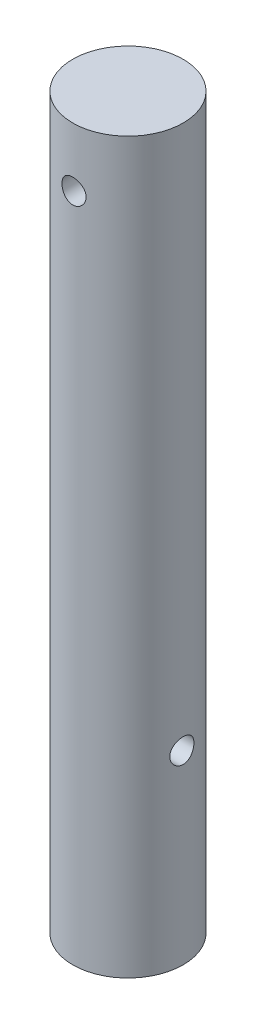
ISO-10303-21;
HEADER;
FILE_DESCRIPTION(('STEP AP214'),'2;1');
FILE_NAME('part.step','',(''),(''),'','','');
FILE_SCHEMA(('AUTOMOTIVE_DESIGN { 1 0 10303 214 1 1 1 1 }'));
ENDSEC;
DATA;
#1=APPLICATION_CONTEXT('core data for automotive mechanical design processes');
#2=APPLICATION_PROTOCOL_DEFINITION('international standard','automotive_design',2000,#1);
#3=PRODUCT_CONTEXT('',#1,'mechanical');
#4=PRODUCT('Part','Part','',(#3));
#5=PRODUCT_RELATED_PRODUCT_CATEGORY('part','',(#4));
#6=PRODUCT_DEFINITION_FORMATION('','',#4);
#7=PRODUCT_DEFINITION_CONTEXT('part definition',#1,'design');
#8=PRODUCT_DEFINITION('design','',#6,#7);
#9=PRODUCT_DEFINITION_SHAPE('','',#8);
#10=(LENGTH_UNIT() NAMED_UNIT(*) SI_UNIT(.MILLI.,.METRE.));
#11=(NAMED_UNIT(*) PLANE_ANGLE_UNIT() SI_UNIT($,.RADIAN.));
#12=(NAMED_UNIT(*) SI_UNIT($,.STERADIAN.) SOLID_ANGLE_UNIT());
#13=UNCERTAINTY_MEASURE_WITH_UNIT(LENGTH_MEASURE(1.E-05),#10,'distance_accuracy_value','');
#14=(GEOMETRIC_REPRESENTATION_CONTEXT(3) GLOBAL_UNCERTAINTY_ASSIGNED_CONTEXT((#13)) GLOBAL_UNIT_ASSIGNED_CONTEXT((#10,
#11,#12)) REPRESENTATION_CONTEXT('',''));
#15=CARTESIAN_POINT('',(0.,0.,0.));
#16=DIRECTION('',(0.,0.,1.));
#17=DIRECTION('',(1.,0.,0.));
#18=AXIS2_PLACEMENT_3D('',#15,#16,#17);
#19=CARTESIAN_POINT('',(0.,-9.525,0.));
#20=DIRECTION('',(0.,1.,0.));
#21=DIRECTION('',(0.,0.,1.));
#22=AXIS2_PLACEMENT_3D('',#19,#20,#21);
#23=CYLINDRICAL_SURFACE('',#22,4.7625);
#24=CARTESIAN_POINT('',(-4.64724566705915,-46.863,-1.0414));
#25=CARTESIAN_POINT('',(-4.64724683426293,-46.8052594354549,-1.04139801362496));
#26=CARTESIAN_POINT('',(-4.64833350092517,-46.7474949910105,-1.03658151779939));
#27=CARTESIAN_POINT('',(-4.65255476760777,-46.6336087908007,-1.01746386740255));
#28=CARTESIAN_POINT('',(-4.6556908487515,-46.5774882537678,-1.00315585314442));
#29=CARTESIAN_POINT('',(-4.66363917155119,-46.4685537577196,-0.965527203784959));
#30=CARTESIAN_POINT('',(-4.66844957404701,-46.4157362452833,-0.942216454681358));
#31=CARTESIAN_POINT('',(-4.679202313415,-46.3147605410028,-0.887272324034088));
#32=CARTESIAN_POINT('',(-4.68514462682847,-46.2666022526281,-0.855639114967133));
#33=CARTESIAN_POINT('',(-4.69760372982455,-46.1754981701297,-0.784378709753431));
#34=CARTESIAN_POINT('',(-4.70412786452575,-46.1326424951388,-0.744637563560157));
#35=CARTESIAN_POINT('',(-4.71695119823604,-46.0541494142651,-0.658535374425396));
#36=CARTESIAN_POINT('',(-4.72325037973522,-46.0185125692768,-0.612173817562527));
#37=CARTESIAN_POINT('',(-4.73499404437961,-45.9551123001179,-0.513542666007839));
#38=CARTESIAN_POINT('',(-4.74042885036034,-45.927435548742,-0.461216106554952));
#39=CARTESIAN_POINT('',(-4.74974844219505,-45.8813018498733,-0.352516010031967));
#40=CARTESIAN_POINT('',(-4.75363340187398,-45.8628438683793,-0.296142927642001));
#41=CARTESIAN_POINT('',(-4.75936366654546,-45.8359550886623,-0.181887019493143));
#42=CARTESIAN_POINT('',(-4.76123996378069,-45.8273717716921,-0.124041667800268));
#43=CARTESIAN_POINT('',(-4.7628488730253,-45.8199991100795,-0.00770365102984375));
#44=CARTESIAN_POINT('',(-4.76258173014628,-45.8212086455823,0.0507889392692712));
#45=CARTESIAN_POINT('',(-4.7599575457801,-45.8332737553604,0.165709632519628));
#46=CARTESIAN_POINT('',(-4.75763612363036,-45.8439649334693,0.222155927894644));
#47=CARTESIAN_POINT('',(-4.75120480370878,-45.874427878627,0.332433306696865));
#48=CARTESIAN_POINT('',(-4.74709482510063,-45.8942000561064,0.386264271798325));
#49=CARTESIAN_POINT('',(-4.7374909127541,-45.9424091815594,0.490239331884415));
#50=CARTESIAN_POINT('',(-4.73198707564586,-45.9709084521832,0.540353578110618));
#51=CARTESIAN_POINT('',(-4.72019893627285,-46.0357163000883,0.635148271211257));
#52=CARTESIAN_POINT('',(-4.71391452779004,-46.0720259406767,0.679827976927225));
#53=CARTESIAN_POINT('',(-4.70110204145526,-46.1523188534707,0.763463015113666));
#54=CARTESIAN_POINT('',(-4.69457161409702,-46.1964460039315,0.802279980264733));
#55=CARTESIAN_POINT('',(-4.68212554890455,-46.2906510439001,0.871988610824726));
#56=CARTESIAN_POINT('',(-4.67620992771903,-46.3407290944775,0.902880061646886));
#57=CARTESIAN_POINT('',(-4.66565707357456,-46.4456380473703,0.95592222957979));
#58=CARTESIAN_POINT('',(-4.66102367598321,-46.5004825776943,0.97804680680204));
#59=CARTESIAN_POINT('',(-4.65361304323723,-46.6132364055119,1.0127238472103));
#60=CARTESIAN_POINT('',(-4.65083551382603,-46.6711452155776,1.0252778279036));
#61=CARTESIAN_POINT('',(-4.64751110841383,-46.7871194979768,1.04024271000873));
#62=CARTESIAN_POINT('',(-4.64691993253734,-46.8451577340028,1.04285508035657));
#63=CARTESIAN_POINT('',(-4.64791567011152,-46.9608404403681,1.03840802942941));
#64=CARTESIAN_POINT('',(-4.6495024340223,-47.0184849374688,1.03134927218535));
#65=CARTESIAN_POINT('',(-4.65463343129432,-47.1310424003158,1.00793513212541));
#66=CARTESIAN_POINT('',(-4.65815428767504,-47.185979611458,0.99169070701029));
#67=CARTESIAN_POINT('',(-4.66673567123808,-47.2923524843477,0.950486488246564));
#68=CARTESIAN_POINT('',(-4.67179634572057,-47.3437878105258,0.925525860765657));
#69=CARTESIAN_POINT('',(-4.68298449147103,-47.4425687414898,0.867153863286206));
#70=CARTESIAN_POINT('',(-4.68912717846546,-47.4898392455922,0.833618379071799));
#71=CARTESIAN_POINT('',(-4.70174708709888,-47.5781556543828,0.75921103069977));
#72=CARTESIAN_POINT('',(-4.7082243501868,-47.6192007853498,0.718338256002518));
#73=CARTESIAN_POINT('',(-4.72092960738021,-47.6946832744679,0.629504904094955));
#74=CARTESIAN_POINT('',(-4.72715070931358,-47.7289832809665,0.581426465048818));
#75=CARTESIAN_POINT('',(-4.73851586605987,-47.7890196640495,0.480073080457866));
#76=CARTESIAN_POINT('',(-4.74365997115273,-47.814756440444,0.426798377672553));
#77=CARTESIAN_POINT('',(-4.75226247126153,-47.8567444874519,0.316896539669138));
#78=CARTESIAN_POINT('',(-4.75573151727163,-47.8730558246138,0.260293224474134));
#79=CARTESIAN_POINT('',(-4.76063908181433,-47.8959175521733,0.145065409410685));
#80=CARTESIAN_POINT('',(-4.76207789535526,-47.9024693607128,0.0864412044614987));
#81=CARTESIAN_POINT('',(-4.76275412632141,-47.9055623173701,-0.0298603228029478));
#82=CARTESIAN_POINT('',(-4.76203664219021,-47.9023085429497,-0.0875320244869774));
#83=CARTESIAN_POINT('',(-4.75857751446408,-47.8863413933666,-0.201485414812264));
#84=CARTESIAN_POINT('',(-4.75583590721532,-47.8736281880621,-0.257767128394096));
#85=CARTESIAN_POINT('',(-4.74863991195574,-47.8392013099453,-0.367184402238855));
#86=CARTESIAN_POINT('',(-4.74419105946765,-47.8175167081639,-0.420329496601131));
#87=CARTESIAN_POINT('',(-4.73405565817542,-47.765790934413,-0.522254272086121));
#88=CARTESIAN_POINT('',(-4.72836898931314,-47.7357489517668,-0.571033529110016));
#89=CARTESIAN_POINT('',(-4.71624362983928,-47.6674924311219,-0.66384231669472));
#90=CARTESIAN_POINT('',(-4.70979271994042,-47.6291336727227,-0.707764193111468));
#91=CARTESIAN_POINT('',(-4.69693179793269,-47.5456233784584,-0.78861772566919));
#92=CARTESIAN_POINT('',(-4.69052179605622,-47.5004702075537,-0.825547694400661));
#93=CARTESIAN_POINT('',(-4.67837298924523,-47.403927290551,-0.891844453069654));
#94=CARTESIAN_POINT('',(-4.67264429711009,-47.3524622742865,-0.921103592206115));
#95=CARTESIAN_POINT('',(-4.66263389205707,-47.2452313088032,-0.97051110043285));
#96=CARTESIAN_POINT('',(-4.6583509550351,-47.1894690474029,-0.990667181888034));
#97=CARTESIAN_POINT('',(-4.65250901438367,-47.0885415511845,-1.01769701357225));
#98=CARTESIAN_POINT('',(-4.65054835699366,-47.0439238549312,-1.02656858972862));
#99=CARTESIAN_POINT('',(-4.64791625537895,-46.9538756769008,-1.03842072126472));
#100=CARTESIAN_POINT('',(-4.64724474840082,-46.9084452347952,-1.04140156339449));
#101=CARTESIAN_POINT('',(-4.64724566705915,-46.863,-1.0414));
#102=B_SPLINE_CURVE_WITH_KNOTS('',3,(#24,#25,#26,#27,#28,#29,#30,#31,#32,#33,#34,#35,#36,#37,
#38,#39,#40,#41,#42,#43,#44,#45,#46,#47,#48,#49,#50,#51,#52,#53,#54,#55,#56,#57,#58,#59,#60,#61,
#62,#63,#64,#65,#66,#67,#68,#69,#70,#71,#72,#73,#74,#75,#76,#77,#78,#79,#80,#81,#82,#83,#84,#85,
#86,#87,#88,#89,#90,#91,#92,#93,#94,#95,#96,#97,#98,#99,#100,#101),.UNSPECIFIED.,.T.,.F.,(4,2,2,
2,2,2,2,2,2,2,2,2,2,2,2,2,2,2,2,2,2,2,2,2,2,2,2,2,2,2,2,2,2,2,2,2,2,2,4),(0.,0.173055140300116,
0.346235487043308,0.519226200880875,0.69221332989857,0.867823714054951,1.0434477377038,
1.22091729879004,1.39836694995534,1.57303737128947,1.74768781859339,1.9193680553078,
2.0910560521551,2.26399990258393,2.43696731257987,2.61353176331568,2.79010099410679,
2.96719280369704,3.1442565278867,3.31771229626417,3.4911561555624,3.66254834344323,
3.83395693198865,4.00800281298307,4.18207030759133,4.35938074440266,4.53668290157354,
4.71284231692531,4.88897613232749,5.06145196582417,5.23392470233289,5.40584287971858,
5.57777773920591,5.75297415311241,5.92821279473666,6.10579293444732,6.28322233975766,
6.41943358750539,6.55563820457845),.UNSPECIFIED.);
#103=CARTESIAN_POINT('',(-4.64724566705915,-46.863,-1.0414));
#104=VERTEX_POINT('',#103);
#105=EDGE_CURVE('E79',#104,#104,#102,.T.);
#106=ORIENTED_EDGE('',*,*,#105,.T.);
#107=EDGE_LOOP('',(#106));
#108=FACE_BOUND('',#107,.T.);
#109=CARTESIAN_POINT('',(4.64724566705915,-46.863,1.0414));
#110=CARTESIAN_POINT('',(4.64724683426293,-46.9207405645451,1.04139801362496));
#111=CARTESIAN_POINT('',(4.64833350092517,-46.9785050089895,1.03658151779939));
#112=CARTESIAN_POINT('',(4.65255476760777,-47.0923912091993,1.01746386740255));
#113=CARTESIAN_POINT('',(4.6556908487515,-47.1485117462322,1.00315585314442));
#114=CARTESIAN_POINT('',(4.66363917155119,-47.2574462422804,0.965527203784959));
#115=CARTESIAN_POINT('',(4.66844957404701,-47.3102637547167,0.942216454681361));
#116=CARTESIAN_POINT('',(4.679202313415,-47.4112394589972,0.887272324034091));
#117=CARTESIAN_POINT('',(4.68514462682847,-47.4593977473719,0.855639114967134));
#118=CARTESIAN_POINT('',(4.69760372982455,-47.5505018298703,0.78437870975343));
#119=CARTESIAN_POINT('',(4.70412786452575,-47.5933575048612,0.744637563560156));
#120=CARTESIAN_POINT('',(4.71695119823604,-47.671850585735,0.658535374425396));
#121=CARTESIAN_POINT('',(4.72325037973522,-47.7074874307232,0.612173817562527));
#122=CARTESIAN_POINT('',(4.73499404437961,-47.7708876998821,0.51354266600784));
#123=CARTESIAN_POINT('',(4.74042885036034,-47.798564451258,0.461216106554953));
#124=CARTESIAN_POINT('',(4.74974844219505,-47.8446981501267,0.352516010031967));
#125=CARTESIAN_POINT('',(4.75363340187398,-47.8631561316207,0.296142927642001));
#126=CARTESIAN_POINT('',(4.75936366654546,-47.8900449113377,0.181887019493144));
#127=CARTESIAN_POINT('',(4.76123996378069,-47.8986282283079,0.124041667800269));
#128=CARTESIAN_POINT('',(4.7628488730253,-47.9060008899205,0.00770365102984466));
#129=CARTESIAN_POINT('',(4.76258173014628,-47.9047913544177,-0.0507889392692702));
#130=CARTESIAN_POINT('',(4.7599575457801,-47.8927262446396,-0.165709632519627));
#131=CARTESIAN_POINT('',(4.75763612363036,-47.8820350665307,-0.222155927894643));
#132=CARTESIAN_POINT('',(4.75120480370878,-47.851572121373,-0.332433306696864));
#133=CARTESIAN_POINT('',(4.74709482510063,-47.8317999438936,-0.386264271798325));
#134=CARTESIAN_POINT('',(4.7374909127541,-47.7835908184406,-0.490239331884412));
#135=CARTESIAN_POINT('',(4.73198707564586,-47.7550915478168,-0.540353578110612));
#136=CARTESIAN_POINT('',(4.72019893627285,-47.6902836999118,-0.635148271211252));
#137=CARTESIAN_POINT('',(4.71391452779004,-47.6539740593234,-0.679827976927223));
#138=CARTESIAN_POINT('',(4.70110204145526,-47.5736811465293,-0.763463015113663));
#139=CARTESIAN_POINT('',(4.69457161409703,-47.5295539960686,-0.802279980264726));
#140=CARTESIAN_POINT('',(4.68212554890455,-47.4353489561,-0.87198861082472));
#141=CARTESIAN_POINT('',(4.67620992771903,-47.3852709055226,-0.902880061646884));
#142=CARTESIAN_POINT('',(4.66565707357456,-47.2803619526297,-0.95592222957979));
#143=CARTESIAN_POINT('',(4.66102367598321,-47.2255174223057,-0.97804680680204));
#144=CARTESIAN_POINT('',(4.65361304323723,-47.1127635944881,-1.0127238472103));
#145=CARTESIAN_POINT('',(4.65083551382603,-47.0548547844224,-1.0252778279036));
#146=CARTESIAN_POINT('',(4.64751110841383,-46.9388805020232,-1.04024271000873));
#147=CARTESIAN_POINT('',(4.64691993253734,-46.8808422659972,-1.04285508035657));
#148=CARTESIAN_POINT('',(4.64791567011152,-46.7651595596319,-1.03840802942941));
#149=CARTESIAN_POINT('',(4.6495024340223,-46.7075150625312,-1.03134927218535));
#150=CARTESIAN_POINT('',(4.65463343129432,-46.5949575996842,-1.00793513212541));
#151=CARTESIAN_POINT('',(4.65815428767504,-46.540020388542,-0.991690707010291));
#152=CARTESIAN_POINT('',(4.66673567123808,-46.4336475156523,-0.950486488246564));
#153=CARTESIAN_POINT('',(4.67179634572057,-46.3822121894742,-0.925525860765656));
#154=CARTESIAN_POINT('',(4.68298449147103,-46.2834312585102,-0.867153863286207));
#155=CARTESIAN_POINT('',(4.68912717846546,-46.2361607544078,-0.833618379071802));
#156=CARTESIAN_POINT('',(4.70174708709888,-46.1478443456172,-0.759211030699773));
#157=CARTESIAN_POINT('',(4.7082243501868,-46.1067992146502,-0.718338256002519));
#158=CARTESIAN_POINT('',(4.72092960738021,-46.0313167255321,-0.629504904094953));
#159=CARTESIAN_POINT('',(4.72715070931358,-45.9970167190335,-0.581426465048817));
#160=CARTESIAN_POINT('',(4.73851586605987,-45.9369803359505,-0.480073080457864));
#161=CARTESIAN_POINT('',(4.74365997115273,-45.911243559556,-0.426798377672552));
#162=CARTESIAN_POINT('',(4.75226247126153,-45.8692555125481,-0.316896539669137));
#163=CARTESIAN_POINT('',(4.75573151727163,-45.8529441753862,-0.260293224474134));
#164=CARTESIAN_POINT('',(4.76063908181433,-45.8300824478267,-0.145065409410685));
#165=CARTESIAN_POINT('',(4.76207789535526,-45.8235306392872,-0.0864412044614986));
#166=CARTESIAN_POINT('',(4.76275412632141,-45.8204376826299,0.0298603228029479));
#167=CARTESIAN_POINT('',(4.76203664219021,-45.8236914570503,0.0875320244869773));
#168=CARTESIAN_POINT('',(4.75857751446408,-45.8396586066334,0.201485414812263));
#169=CARTESIAN_POINT('',(4.75583590721532,-45.8523718119379,0.257767128394096));
#170=CARTESIAN_POINT('',(4.74863991195574,-45.8867986900547,0.367184402238855));
#171=CARTESIAN_POINT('',(4.74419105946765,-45.9084832918361,0.420329496601131));
#172=CARTESIAN_POINT('',(4.73405565817542,-45.960209065587,0.522254272086121));
#173=CARTESIAN_POINT('',(4.72836898931314,-45.9902510482332,0.571033529110016));
#174=CARTESIAN_POINT('',(4.71624362983928,-46.0585075688781,0.66384231669472));
#175=CARTESIAN_POINT('',(4.70979271994042,-46.0968663272773,0.707764193111468));
#176=CARTESIAN_POINT('',(4.69693179793269,-46.1803766215417,0.788617725669189));
#177=CARTESIAN_POINT('',(4.69052179605622,-46.2255297924464,0.825547694400661));
#178=CARTESIAN_POINT('',(4.67837298924523,-46.322072709449,0.891844453069654));
#179=CARTESIAN_POINT('',(4.67264429711009,-46.3735377257135,0.921103592206115));
#180=CARTESIAN_POINT('',(4.66263389205707,-46.4807686911968,0.97051110043285));
#181=CARTESIAN_POINT('',(4.6583509550351,-46.5365309525971,0.990667181888033));
#182=CARTESIAN_POINT('',(4.65250901438367,-46.6374584488155,1.01769701357225));
#183=CARTESIAN_POINT('',(4.65054835699367,-46.6820761450687,1.02656858972861));
#184=CARTESIAN_POINT('',(4.64791625537895,-46.7721243230992,1.03842072126472));
#185=CARTESIAN_POINT('',(4.64724474840082,-46.8175547652048,1.04140156339449));
#186=CARTESIAN_POINT('',(4.64724566705915,-46.863,1.0414));
#187=B_SPLINE_CURVE_WITH_KNOTS('',3,(#109,#110,#111,#112,#113,#114,#115,#116,#117,#118,#119,
#120,#121,#122,#123,#124,#125,#126,#127,#128,#129,#130,#131,#132,#133,#134,#135,#136,#137,#138,
#139,#140,#141,#142,#143,#144,#145,#146,#147,#148,#149,#150,#151,#152,#153,#154,#155,#156,#157,
#158,#159,#160,#161,#162,#163,#164,#165,#166,#167,#168,#169,#170,#171,#172,#173,#174,#175,#176,
#177,#178,#179,#180,#181,#182,#183,#184,#185,#186),.UNSPECIFIED.,.T.,.F.,(4,2,2,2,2,2,2,2,2,2,2,
2,2,2,2,2,2,2,2,2,2,2,2,2,2,2,2,2,2,2,2,2,2,2,2,2,2,2,4),(0.,0.173055140300116,
0.346235487043308,0.519226200880874,0.692213329898571,0.867823714054952,1.0434477377038,
1.22091729879004,1.39836694995534,1.57303737128947,1.74768781859339,1.9193680553078,
2.0910560521551,2.26399990258392,2.43696731257987,2.61353176331566,2.79010099410679,
2.96719280369704,3.1442565278867,3.31771229626417,3.4911561555624,3.66254834344323,
3.83395693198865,4.00800281298306,4.18207030759133,4.35938074440266,4.53668290157354,
4.71284231692531,4.88897613232749,5.06145196582417,5.23392470233289,5.40584287971858,
5.57777773920591,5.75297415311241,5.92821279473666,6.10579293444732,6.28322233975766,
6.41943358750537,6.55563820457845),.UNSPECIFIED.);
#188=CARTESIAN_POINT('',(4.64724566705915,-46.863,1.0414));
#189=VERTEX_POINT('',#188);
#190=EDGE_CURVE('E83',#189,#189,#187,.T.);
#191=ORIENTED_EDGE('',*,*,#190,.F.);
#192=EDGE_LOOP('',(#191));
#193=FACE_BOUND('',#192,.T.);
#194=CARTESIAN_POINT('',(-1.0414,-5.08,4.64724566705915));
#195=CARTESIAN_POINT('',(-1.04139801362496,-5.1377405645451,4.64724683426293));
#196=CARTESIAN_POINT('',(-1.03658151779939,-5.19550500898947,4.64833350092517));
#197=CARTESIAN_POINT('',(-1.01746386740255,-5.30939120919932,4.65255476760777));
#198=CARTESIAN_POINT('',(-1.00315585314442,-5.36551174623215,4.6556908487515));
#199=CARTESIAN_POINT('',(-0.965527203784957,-5.47444624228043,4.66363917155119));
#200=CARTESIAN_POINT('',(-0.942216454681359,-5.52726375471671,4.66844957404701));
#201=CARTESIAN_POINT('',(-0.88727232403409,-5.62823945899716,4.679202313415));
#202=CARTESIAN_POINT('',(-0.855639114967134,-5.67639774737194,4.68514462682847));
#203=CARTESIAN_POINT('',(-0.784378709753432,-5.76750182987032,4.69760372982455));
#204=CARTESIAN_POINT('',(-0.744637563560157,-5.81035750486115,4.70412786452575));
#205=CARTESIAN_POINT('',(-0.658535374425396,-5.88885058573494,4.71695119823604));
#206=CARTESIAN_POINT('',(-0.612173817562526,-5.92448743072324,4.72325037973522));
#207=CARTESIAN_POINT('',(-0.513542666007838,-5.98788769988214,4.73499404437961));
#208=CARTESIAN_POINT('',(-0.461216106554951,-6.01556445125803,4.74042885036034));
#209=CARTESIAN_POINT('',(-0.352516010031965,-6.06169815012671,4.74974844219505));
#210=CARTESIAN_POINT('',(-0.296142927641999,-6.08015613162073,4.75363340187398));
#211=CARTESIAN_POINT('',(-0.181887019493141,-6.10704491133772,4.75936366654545));
#212=CARTESIAN_POINT('',(-0.124041667800267,-6.11562822830789,4.76123996378069));
#213=CARTESIAN_POINT('',(-0.00770365102984294,-6.12300088992053,4.7628488730253));
#214=CARTESIAN_POINT('',(0.0507889392692714,-6.12179135441771,4.76258173014628));
#215=CARTESIAN_POINT('',(0.165709632519628,-6.10972624463959,4.7599575457801));
#216=CARTESIAN_POINT('',(0.222155927894645,-6.09903506653072,4.75763612363036));
#217=CARTESIAN_POINT('',(0.332433306696866,-6.06857212137304,4.75120480370878));
#218=CARTESIAN_POINT('',(0.386264271798326,-6.0487999438936,4.74709482510063));
#219=CARTESIAN_POINT('',(0.490239331884414,-6.0005908184406,4.7374909127541));
#220=CARTESIAN_POINT('',(0.540353578110617,-5.97209154781684,4.73198707564586));
#221=CARTESIAN_POINT('',(0.635148271211256,-5.90728369991175,4.72019893627285));
#222=CARTESIAN_POINT('',(0.679827976927225,-5.87097405932335,4.71391452779004));
#223=CARTESIAN_POINT('',(0.763463015113664,-5.79068114652927,4.70110204145526));
#224=CARTESIAN_POINT('',(0.802279980264728,-5.74655399606855,4.69457161409702));
#225=CARTESIAN_POINT('',(0.871988610824721,-5.65234895609995,4.68212554890455));
#226=CARTESIAN_POINT('',(0.902880061646884,-5.60227090552255,4.67620992771903));
#227=CARTESIAN_POINT('',(0.955922229579789,-5.49736195262965,4.66565707357456));
#228=CARTESIAN_POINT('',(0.978046806802039,-5.44251742230574,4.66102367598321));
#229=CARTESIAN_POINT('',(1.0127238472103,-5.32976359448813,4.65361304323723));
#230=CARTESIAN_POINT('',(1.0252778279036,-5.27185478442239,4.65083551382603));
#231=CARTESIAN_POINT('',(1.04024271000873,-5.15588050202321,4.64751110841383));
#232=CARTESIAN_POINT('',(1.04285508035657,-5.09784226599718,4.64691993253734));
#233=CARTESIAN_POINT('',(1.03840802942941,-4.98215955963193,4.64791567011152));
#234=CARTESIAN_POINT('',(1.03134927218535,-4.92451506253123,4.6495024340223));
#235=CARTESIAN_POINT('',(1.00793513212541,-4.81195759968417,4.65463343129432));
#236=CARTESIAN_POINT('',(0.99169070701029,-4.75702038854196,4.65815428767504));
#237=CARTESIAN_POINT('',(0.950486488246564,-4.65064751565233,4.66673567123808));
#238=CARTESIAN_POINT('',(0.925525860765655,-4.59921218947419,4.67179634572057));
#239=CARTESIAN_POINT('',(0.867153863286205,-4.50043125851024,4.68298449147103));
#240=CARTESIAN_POINT('',(0.8336183790718,-4.45316075440777,4.68912717846546));
#241=CARTESIAN_POINT('',(0.75921103069977,-4.36484434561723,4.70174708709888));
#242=CARTESIAN_POINT('',(0.718338256002515,-4.32379921465023,4.7082243501868));
#243=CARTESIAN_POINT('',(0.62950490409495,-4.24831672553206,4.72092960738021));
#244=CARTESIAN_POINT('',(0.581426465048814,-4.21401671903347,4.72715070931358));
#245=CARTESIAN_POINT('',(0.480073080457863,-4.15398033595051,4.73851586605987));
#246=CARTESIAN_POINT('',(0.426798377672552,-4.12824355955597,4.74365997115273));
#247=CARTESIAN_POINT('',(0.316896539669137,-4.0862555125481,4.75226247126153));
#248=CARTESIAN_POINT('',(0.260293224474134,-4.06994417538617,4.75573151727163));
#249=CARTESIAN_POINT('',(0.145065409410684,-4.04708244782672,4.76063908181433));
#250=CARTESIAN_POINT('',(0.0864412044614981,-4.04053063928721,4.76207789535526));
#251=CARTESIAN_POINT('',(-0.0298603228029482,-4.03743768262992,4.76275412632141));
#252=CARTESIAN_POINT('',(-0.0875320244869775,-4.04069145705028,4.76203664219021));
#253=CARTESIAN_POINT('',(-0.201485414812264,-4.05665860663344,4.75857751446408));
#254=CARTESIAN_POINT('',(-0.257767128394097,-4.06937181193795,4.75583590721532));
#255=CARTESIAN_POINT('',(-0.367184402238857,-4.10379869005474,4.74863991195574));
#256=CARTESIAN_POINT('',(-0.420329496601133,-4.12548329183608,4.74419105946765));
#257=CARTESIAN_POINT('',(-0.522254272086122,-4.17720906558699,4.73405565817542));
#258=CARTESIAN_POINT('',(-0.571033529110016,-4.2072510482332,4.72836898931314));
#259=CARTESIAN_POINT('',(-0.663842316694721,-4.27550756887815,4.71624362983928));
#260=CARTESIAN_POINT('',(-0.70776419311147,-4.31386632727733,4.70979271994042));
#261=CARTESIAN_POINT('',(-0.788617725669192,-4.39737662154165,4.69693179793269));
#262=CARTESIAN_POINT('',(-0.825547694400662,-4.44252979244635,4.69052179605622));
#263=CARTESIAN_POINT('',(-0.891844453069654,-4.53907270944899,4.67837298924523));
#264=CARTESIAN_POINT('',(-0.921103592206116,-4.59053772571349,4.67264429711009));
#265=CARTESIAN_POINT('',(-0.970511100432851,-4.69776869119684,4.66263389205707));
#266=CARTESIAN_POINT('',(-0.990667181888034,-4.75353095259707,4.6583509550351));
#267=CARTESIAN_POINT('',(-1.01769701357225,-4.85445844881553,4.65250901438367));
#268=CARTESIAN_POINT('',(-1.02656858972861,-4.89907614506876,4.65054835699367));
#269=CARTESIAN_POINT('',(-1.03842072126472,-4.98912432309922,4.64791625537895));
#270=CARTESIAN_POINT('',(-1.04140156339449,-5.03455476520484,4.64724474840082));
#271=CARTESIAN_POINT('',(-1.0414,-5.08,4.64724566705915));
#272=B_SPLINE_CURVE_WITH_KNOTS('',3,(#194,#195,#196,#197,#198,#199,#200,#201,#202,#203,#204,
#205,#206,#207,#208,#209,#210,#211,#212,#213,#214,#215,#216,#217,#218,#219,#220,#221,#222,#223,
#224,#225,#226,#227,#228,#229,#230,#231,#232,#233,#234,#235,#236,#237,#238,#239,#240,#241,#242,
#243,#244,#245,#246,#247,#248,#249,#250,#251,#252,#253,#254,#255,#256,#257,#258,#259,#260,#261,
#262,#263,#264,#265,#266,#267,#268,#269,#270,#271),.UNSPECIFIED.,.T.,.F.,(4,2,2,2,2,2,2,2,2,2,2,
2,2,2,2,2,2,2,2,2,2,2,2,2,2,2,2,2,2,2,2,2,2,2,2,2,2,2,4),(0.,0.173055140300112,0.34623548704331,
0.519226200880874,0.692213329898566,0.867823714054948,1.0434477377038,1.22091729879004,
1.39836694995534,1.57303737128947,1.74768781859339,1.9193680553078,2.09105605215509,
2.26399990258392,2.43696731257987,2.61353176331566,2.79010099410678,2.96719280369704,
3.1442565278867,3.31771229626416,3.4911561555624,3.66254834344322,3.83395693198864,
4.00800281298306,4.18207030759133,4.35938074440266,4.53668290157354,4.7128423169253,
4.88897613232748,5.06145196582416,5.23392470233288,5.40584287971857,5.5777777392059,
5.7529741531124,5.92821279473666,6.10579293444731,6.28322233975766,6.41943358750538,
6.55563820457844),.UNSPECIFIED.);
#273=CARTESIAN_POINT('',(-1.0414,-5.08,4.64724566705915));
#274=VERTEX_POINT('',#273);
#275=EDGE_CURVE('E48',#274,#274,#272,.T.);
#276=ORIENTED_EDGE('',*,*,#275,.F.);
#277=EDGE_LOOP('',(#276));
#278=FACE_BOUND('',#277,.T.);
#279=CARTESIAN_POINT('',(1.0414,-5.08,-4.64724566705915));
#280=CARTESIAN_POINT('',(1.04139801362496,-5.02225943545491,-4.64724683426293));
#281=CARTESIAN_POINT('',(1.03658151779939,-4.96449499101053,-4.64833350092517));
#282=CARTESIAN_POINT('',(1.01746386740255,-4.85060879080068,-4.65255476760777));
#283=CARTESIAN_POINT('',(1.00315585314442,-4.79448825376785,-4.6556908487515));
#284=CARTESIAN_POINT('',(0.965527203784957,-4.68555375771957,-4.66363917155119));
#285=CARTESIAN_POINT('',(0.942216454681358,-4.63273624528329,-4.66844957404701));
#286=CARTESIAN_POINT('',(0.88727232403409,-4.53176054100285,-4.679202313415));
#287=CARTESIAN_POINT('',(0.855639114967134,-4.48360225262806,-4.68514462682847));
#288=CARTESIAN_POINT('',(0.784378709753432,-4.39249817012968,-4.69760372982455));
#289=CARTESIAN_POINT('',(0.744637563560157,-4.34964249513885,-4.70412786452575));
#290=CARTESIAN_POINT('',(0.658535374425396,-4.27114941426506,-4.71695119823604));
#291=CARTESIAN_POINT('',(0.612173817562527,-4.23551256927676,-4.72325037973522));
#292=CARTESIAN_POINT('',(0.513542666007839,-4.17211230011786,-4.73499404437961));
#293=CARTESIAN_POINT('',(0.461216106554952,-4.14443554874197,-4.74042885036034));
#294=CARTESIAN_POINT('',(0.352516010031965,-4.09830184987329,-4.74974844219505));
#295=CARTESIAN_POINT('',(0.296142927641999,-4.07984386837927,-4.75363340187398));
#296=CARTESIAN_POINT('',(0.181887019493142,-4.05295508866228,-4.75936366654545));
#297=CARTESIAN_POINT('',(0.124041667800267,-4.04437177169211,-4.76123996378069));
#298=CARTESIAN_POINT('',(0.00770365102984329,-4.03699911007947,-4.7628488730253));
#299=CARTESIAN_POINT('',(-0.050788939269271,-4.03820864558229,-4.76258173014628));
#300=CARTESIAN_POINT('',(-0.165709632519628,-4.05027375536041,-4.7599575457801));
#301=CARTESIAN_POINT('',(-0.222155927894644,-4.06096493346928,-4.75763612363036));
#302=CARTESIAN_POINT('',(-0.332433306696865,-4.09142787862696,-4.75120480370878));
#303=CARTESIAN_POINT('',(-0.386264271798326,-4.11120005610639,-4.74709482510063));
#304=CARTESIAN_POINT('',(-0.490239331884414,-4.15940918155941,-4.7374909127541));
#305=CARTESIAN_POINT('',(-0.540353578110617,-4.18790845218316,-4.73198707564586));
#306=CARTESIAN_POINT('',(-0.635148271211256,-4.25271630008825,-4.72019893627285));
#307=CARTESIAN_POINT('',(-0.679827976927225,-4.28902594067665,-4.71391452779004));
#308=CARTESIAN_POINT('',(-0.763463015113664,-4.36931885347073,-4.70110204145526));
#309=CARTESIAN_POINT('',(-0.802279980264728,-4.41344600393145,-4.69457161409702));
#310=CARTESIAN_POINT('',(-0.871988610824721,-4.50765104390005,-4.68212554890455));
#311=CARTESIAN_POINT('',(-0.902880061646884,-4.55772909447745,-4.67620992771903));
#312=CARTESIAN_POINT('',(-0.955922229579789,-4.66263804737035,-4.66565707357456));
#313=CARTESIAN_POINT('',(-0.978046806802039,-4.71748257769426,-4.66102367598321));
#314=CARTESIAN_POINT('',(-1.0127238472103,-4.83023640551187,-4.65361304323723));
#315=CARTESIAN_POINT('',(-1.0252778279036,-4.88814521557761,-4.65083551382603));
#316=CARTESIAN_POINT('',(-1.04024271000873,-5.00411949797679,-4.64751110841383));
#317=CARTESIAN_POINT('',(-1.04285508035657,-5.06215773400282,-4.64691993253734));
#318=CARTESIAN_POINT('',(-1.03840802942941,-5.17784044036808,-4.64791567011152));
#319=CARTESIAN_POINT('',(-1.03134927218535,-5.23548493746877,-4.6495024340223));
#320=CARTESIAN_POINT('',(-1.00793513212541,-5.34804240031583,-4.65463343129432));
#321=CARTESIAN_POINT('',(-0.99169070701029,-5.40297961145804,-4.65815428767504));
#322=CARTESIAN_POINT('',(-0.950486488246564,-5.50935248434767,-4.66673567123808));
#323=CARTESIAN_POINT('',(-0.925525860765655,-5.56078781052581,-4.67179634572057));
#324=CARTESIAN_POINT('',(-0.867153863286206,-5.65956874148976,-4.68298449147103));
#325=CARTESIAN_POINT('',(-0.8336183790718,-5.70683924559223,-4.68912717846546));
#326=CARTESIAN_POINT('',(-0.759211030699769,-5.79515565438277,-4.70174708709888));
#327=CARTESIAN_POINT('',(-0.718338256002515,-5.83620078534977,-4.7082243501868));
#328=CARTESIAN_POINT('',(-0.62950490409495,-5.91168327446794,-4.72092960738021));
#329=CARTESIAN_POINT('',(-0.581426465048814,-5.94598328096653,-4.72715070931358));
#330=CARTESIAN_POINT('',(-0.480073080457863,-6.00601966404949,-4.73851586605987));
#331=CARTESIAN_POINT('',(-0.426798377672552,-6.03175644044403,-4.74365997115273));
#332=CARTESIAN_POINT('',(-0.316896539669137,-6.0737444874519,-4.75226247126153));
#333=CARTESIAN_POINT('',(-0.260293224474134,-6.09005582461383,-4.75573151727163));
#334=CARTESIAN_POINT('',(-0.145065409410684,-6.11291755217328,-4.76063908181433));
#335=CARTESIAN_POINT('',(-0.086441204461498,-6.11946936071279,-4.76207789535526));
#336=CARTESIAN_POINT('',(0.0298603228029482,-6.12256231737008,-4.76275412632141));
#337=CARTESIAN_POINT('',(0.0875320244869776,-6.11930854294972,-4.76203664219021));
#338=CARTESIAN_POINT('',(0.201485414812264,-6.10334139336656,-4.75857751446408));
#339=CARTESIAN_POINT('',(0.257767128394097,-6.09062818806206,-4.75583590721532));
#340=CARTESIAN_POINT('',(0.367184402238857,-6.05620130994526,-4.74863991195574));
#341=CARTESIAN_POINT('',(0.420329496601133,-6.03451670816392,-4.74419105946765));
#342=CARTESIAN_POINT('',(0.522254272086122,-5.98279093441301,-4.73405565817542));
#343=CARTESIAN_POINT('',(0.571033529110016,-5.9527489517668,-4.72836898931314));
#344=CARTESIAN_POINT('',(0.663842316694721,-5.88449243112185,-4.71624362983928));
#345=CARTESIAN_POINT('',(0.70776419311147,-5.84613367272267,-4.70979271994042));
#346=CARTESIAN_POINT('',(0.788617725669192,-5.76262337845835,-4.69693179793269));
#347=CARTESIAN_POINT('',(0.825547694400662,-5.71747020755365,-4.69052179605622));
#348=CARTESIAN_POINT('',(0.891844453069654,-5.62092729055102,-4.67837298924523));
#349=CARTESIAN_POINT('',(0.921103592206116,-5.56946227428651,-4.67264429711009));
#350=CARTESIAN_POINT('',(0.970511100432851,-5.46223130880316,-4.66263389205707));
#351=CARTESIAN_POINT('',(0.990667181888034,-5.40646904740293,-4.6583509550351));
#352=CARTESIAN_POINT('',(1.01769701357225,-5.30554155118447,-4.65250901438367));
#353=CARTESIAN_POINT('',(1.02656858972861,-5.26092385493124,-4.65054835699367));
#354=CARTESIAN_POINT('',(1.03842072126472,-5.17087567690078,-4.64791625537895));
#355=CARTESIAN_POINT('',(1.04140156339449,-5.12544523479516,-4.64724474840082));
#356=CARTESIAN_POINT('',(1.0414,-5.08,-4.64724566705915));
#357=B_SPLINE_CURVE_WITH_KNOTS('',3,(#279,#280,#281,#282,#283,#284,#285,#286,#287,#288,#289,
#290,#291,#292,#293,#294,#295,#296,#297,#298,#299,#300,#301,#302,#303,#304,#305,#306,#307,#308,
#309,#310,#311,#312,#313,#314,#315,#316,#317,#318,#319,#320,#321,#322,#323,#324,#325,#326,#327,
#328,#329,#330,#331,#332,#333,#334,#335,#336,#337,#338,#339,#340,#341,#342,#343,#344,#345,#346,
#347,#348,#349,#350,#351,#352,#353,#354,#355,#356),.UNSPECIFIED.,.T.,.F.,(4,2,2,2,2,2,2,2,2,2,2,
2,2,2,2,2,2,2,2,2,2,2,2,2,2,2,2,2,2,2,2,2,2,2,2,2,2,2,4),(0.,0.173055140300112,0.34623548704331,
0.519226200880874,0.692213329898566,0.867823714054948,1.0434477377038,1.22091729879004,
1.39836694995534,1.57303737128947,1.74768781859339,1.9193680553078,2.09105605215509,
2.26399990258392,2.43696731257987,2.61353176331566,2.79010099410678,2.96719280369704,
3.1442565278867,3.31771229626416,3.4911561555624,3.66254834344322,3.83395693198864,
4.00800281298306,4.18207030759133,4.35938074440266,4.53668290157354,4.7128423169253,
4.88897613232748,5.06145196582416,5.23392470233288,5.40584287971857,5.5777777392059,
5.7529741531124,5.92821279473666,6.10579293444731,6.28322233975766,6.41943358750538,
6.55563820457844),.UNSPECIFIED.);
#358=CARTESIAN_POINT('',(1.0414,-5.08,-4.64724566705915));
#359=VERTEX_POINT('',#358);
#360=EDGE_CURVE('E44',#359,#359,#357,.T.);
#361=ORIENTED_EDGE('',*,*,#360,.T.);
#362=EDGE_LOOP('',(#361));
#363=FACE_BOUND('',#362,.T.);
#364=CARTESIAN_POINT('',(0.,0.,0.));
#365=DIRECTION('',(0.,1.,0.));
#366=DIRECTION('',(0.,0.,1.));
#367=AXIS2_PLACEMENT_3D('',#364,#365,#366);
#368=CIRCLE('',#367,4.7625);
#369=CARTESIAN_POINT('',(0.,0.,4.7625));
#370=VERTEX_POINT('',#369);
#371=EDGE_CURVE('E10',#370,#370,#368,.T.);
#372=ORIENTED_EDGE('',*,*,#371,.F.);
#373=EDGE_LOOP('',(#372));
#374=FACE_BOUND('',#373,.T.);
#375=CARTESIAN_POINT('',(0.,-62.865,0.));
#376=DIRECTION('',(0.,-1.,0.));
#377=DIRECTION('',(0.,0.,-1.));
#378=AXIS2_PLACEMENT_3D('',#375,#376,#377);
#379=CIRCLE('',#378,4.7625);
#380=CARTESIAN_POINT('',(0.,-62.865,-4.7625));
#381=VERTEX_POINT('',#380);
#382=EDGE_CURVE('E40',#381,#381,#379,.T.);
#383=ORIENTED_EDGE('',*,*,#382,.F.);
#384=EDGE_LOOP('',(#383));
#385=FACE_BOUND('',#384,.T.);
#386=ADVANCED_FACE('F34',(#108,#193,#278,#363,#374,#385),#23,.T.);
#387=CARTESIAN_POINT('',(0.,0.,0.));
#388=DIRECTION('',(0.,1.,0.));
#389=DIRECTION('',(0.,0.,1.));
#390=AXIS2_PLACEMENT_3D('',#387,#388,#389);
#391=PLANE('',#390);
#392=ORIENTED_EDGE('',*,*,#371,.T.);
#393=EDGE_LOOP('',(#392));
#394=FACE_BOUND('',#393,.T.);
#395=ADVANCED_FACE('F68',(#394),#391,.T.);
#396=CARTESIAN_POINT('',(0.,-62.865,0.));
#397=DIRECTION('',(0.,-1.,0.));
#398=DIRECTION('',(0.,0.,-1.));
#399=AXIS2_PLACEMENT_3D('',#396,#397,#398);
#400=PLANE('',#399);
#401=ORIENTED_EDGE('',*,*,#382,.T.);
#402=EDGE_LOOP('',(#401));
#403=FACE_BOUND('',#402,.T.);
#404=ADVANCED_FACE('F66',(#403),#400,.T.);
#405=CARTESIAN_POINT('',(0.,-5.08,-4.7635));
#406=DIRECTION('',(0.,0.,1.));
#407=DIRECTION('',(1.,0.,0.));
#408=AXIS2_PLACEMENT_3D('',#405,#406,#407);
#409=CYLINDRICAL_SURFACE('',#408,1.0414);
#410=ORIENTED_EDGE('',*,*,#360,.F.);
#411=EDGE_LOOP('',(#410));
#412=FACE_BOUND('',#411,.T.);
#413=ORIENTED_EDGE('',*,*,#275,.T.);
#414=EDGE_LOOP('',(#413));
#415=FACE_BOUND('',#414,.T.);
#416=ADVANCED_FACE('F62',(#412,#415),#409,.F.);
#417=CARTESIAN_POINT('',(-4.7635,-46.863,0.));
#418=DIRECTION('',(1.,0.,0.));
#419=DIRECTION('',(0.,0.,-1.));
#420=AXIS2_PLACEMENT_3D('',#417,#418,#419);
#421=CYLINDRICAL_SURFACE('',#420,1.0414);
#422=ORIENTED_EDGE('',*,*,#105,.F.);
#423=EDGE_LOOP('',(#422));
#424=FACE_BOUND('',#423,.T.);
#425=ORIENTED_EDGE('',*,*,#190,.T.);
#426=EDGE_LOOP('',(#425));
#427=FACE_BOUND('',#426,.T.);
#428=ADVANCED_FACE('F93',(#424,#427),#421,.F.);
#429=CLOSED_SHELL('',(#386,#395,#404,#416,#428));
#430=MANIFOLD_SOLID_BREP('B2',#429);
#431=ADVANCED_BREP_SHAPE_REPRESENTATION('',(#18,#430),#14);
#432=SHAPE_DEFINITION_REPRESENTATION(#9,#431);
ENDSEC;
END-ISO-10303-21;
